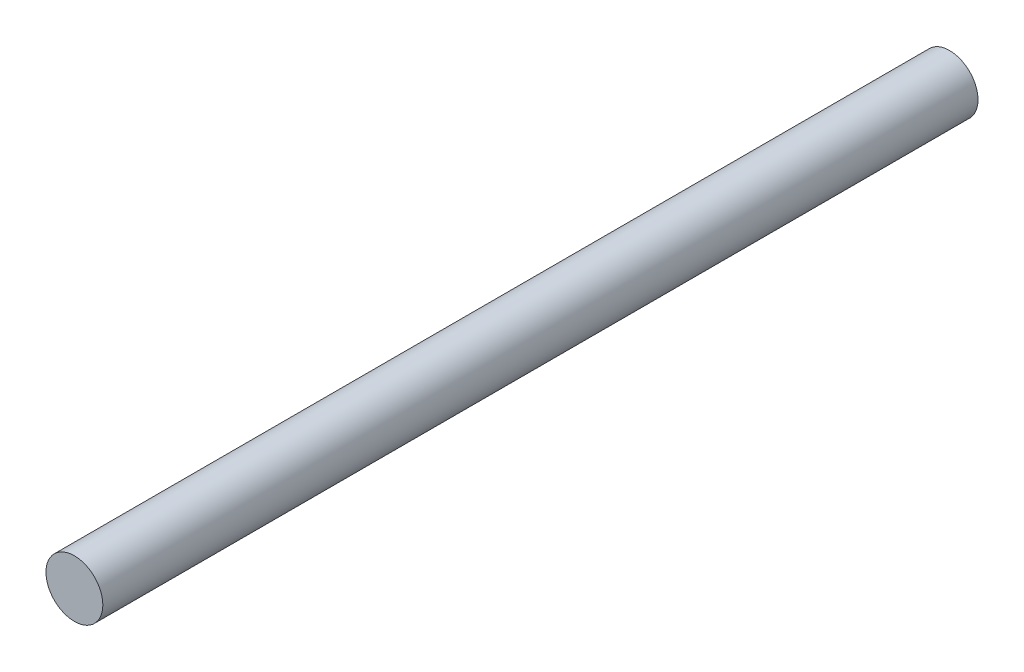
ISO-10303-21;
HEADER;
FILE_DESCRIPTION(('STEP AP214'),'2;1');
FILE_NAME('part.step','',(''),(''),'','','');
FILE_SCHEMA(('AUTOMOTIVE_DESIGN { 1 0 10303 214 1 1 1 1 }'));
ENDSEC;
DATA;
#1=APPLICATION_CONTEXT('core data for automotive mechanical design processes');
#2=APPLICATION_PROTOCOL_DEFINITION('international standard','automotive_design',2000,#1);
#3=PRODUCT_CONTEXT('',#1,'mechanical');
#4=PRODUCT('Part','Part','',(#3));
#5=PRODUCT_RELATED_PRODUCT_CATEGORY('part','',(#4));
#6=PRODUCT_DEFINITION_FORMATION('','',#4);
#7=PRODUCT_DEFINITION_CONTEXT('part definition',#1,'design');
#8=PRODUCT_DEFINITION('design','',#6,#7);
#9=PRODUCT_DEFINITION_SHAPE('','',#8);
#10=(LENGTH_UNIT() NAMED_UNIT(*) SI_UNIT(.MILLI.,.METRE.));
#11=(NAMED_UNIT(*) PLANE_ANGLE_UNIT() SI_UNIT($,.RADIAN.));
#12=(NAMED_UNIT(*) SI_UNIT($,.STERADIAN.) SOLID_ANGLE_UNIT());
#13=UNCERTAINTY_MEASURE_WITH_UNIT(LENGTH_MEASURE(1.E-05),#10,'distance_accuracy_value','');
#14=(GEOMETRIC_REPRESENTATION_CONTEXT(3) GLOBAL_UNCERTAINTY_ASSIGNED_CONTEXT((#13)) GLOBAL_UNIT_ASSIGNED_CONTEXT((#10,
#11,#12)) REPRESENTATION_CONTEXT('',''));
#15=CARTESIAN_POINT('',(0.,0.,0.));
#16=DIRECTION('',(0.,0.,1.));
#17=DIRECTION('',(1.,0.,0.));
#18=AXIS2_PLACEMENT_3D('',#15,#16,#17);
#19=CARTESIAN_POINT('',(0.,0.,100.));
#20=DIRECTION('',(0.,0.,-1.));
#21=DIRECTION('',(-1.,0.,0.));
#22=AXIS2_PLACEMENT_3D('',#19,#20,#21);
#23=CYLINDRICAL_SURFACE('',#22,3.25);
#24=CARTESIAN_POINT('',(0.,0.,100.));
#25=DIRECTION('',(0.,0.,1.));
#26=DIRECTION('',(1.,0.,0.));
#27=AXIS2_PLACEMENT_3D('',#24,#25,#26);
#28=CIRCLE('',#27,3.25);
#29=CARTESIAN_POINT('',(3.25,0.,100.));
#30=VERTEX_POINT('',#29);
#31=EDGE_CURVE('E10',#30,#30,#28,.T.);
#32=ORIENTED_EDGE('',*,*,#31,.F.);
#33=EDGE_LOOP('',(#32));
#34=FACE_BOUND('',#33,.T.);
#35=CARTESIAN_POINT('',(0.,0.,0.));
#36=DIRECTION('',(0.,0.,1.));
#37=DIRECTION('',(1.,0.,0.));
#38=AXIS2_PLACEMENT_3D('',#35,#36,#37);
#39=CIRCLE('',#38,3.25);
#40=CARTESIAN_POINT('',(3.25,0.,0.));
#41=VERTEX_POINT('',#40);
#42=EDGE_CURVE('E34',#41,#41,#39,.T.);
#43=ORIENTED_EDGE('',*,*,#42,.T.);
#44=EDGE_LOOP('',(#43));
#45=FACE_BOUND('',#44,.T.);
#46=ADVANCED_FACE('F31',(#34,#45),#23,.T.);
#47=CARTESIAN_POINT('',(0.,0.,100.));
#48=DIRECTION('',(0.,0.,1.));
#49=DIRECTION('',(1.,0.,0.));
#50=AXIS2_PLACEMENT_3D('',#47,#48,#49);
#51=PLANE('',#50);
#52=ORIENTED_EDGE('',*,*,#31,.T.);
#53=EDGE_LOOP('',(#52));
#54=FACE_BOUND('',#53,.T.);
#55=ADVANCED_FACE('F46',(#54),#51,.T.);
#56=CARTESIAN_POINT('',(0.,0.,0.));
#57=DIRECTION('',(0.,0.,1.));
#58=DIRECTION('',(1.,0.,0.));
#59=AXIS2_PLACEMENT_3D('',#56,#57,#58);
#60=PLANE('',#59);
#61=ORIENTED_EDGE('',*,*,#42,.F.);
#62=EDGE_LOOP('',(#61));
#63=FACE_BOUND('',#62,.T.);
#64=ADVANCED_FACE('F44',(#63),#60,.F.);
#65=CLOSED_SHELL('',(#46,#55,#64));
#66=MANIFOLD_SOLID_BREP('B2',#65);
#67=ADVANCED_BREP_SHAPE_REPRESENTATION('',(#18,#66),#14);
#68=SHAPE_DEFINITION_REPRESENTATION(#9,#67);
ENDSEC;
END-ISO-10303-21;
